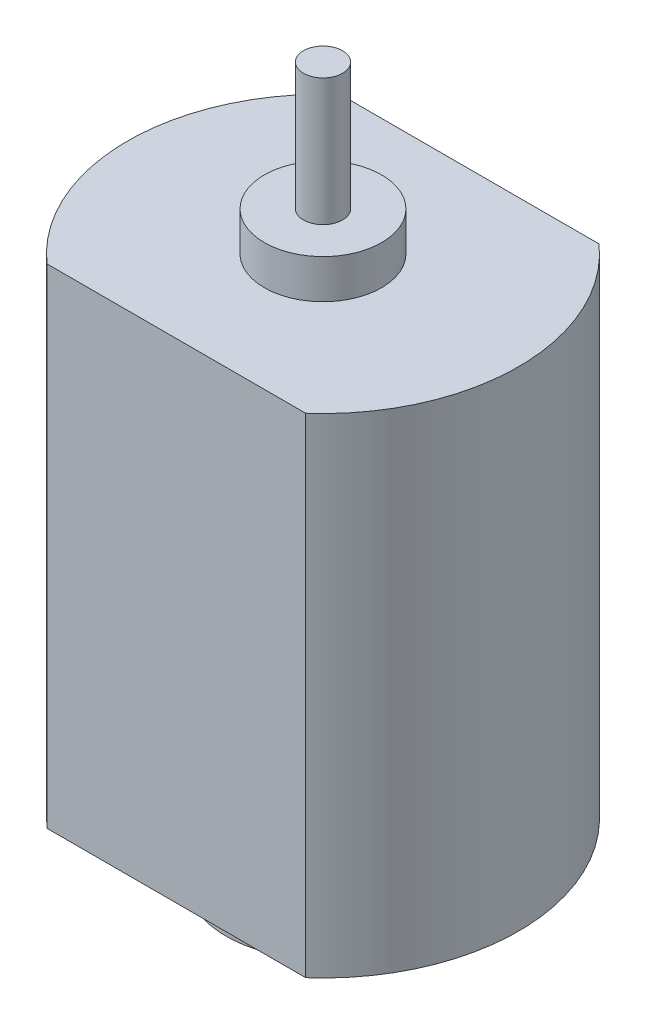
ISO-10303-21;
HEADER;
FILE_DESCRIPTION(('STEP AP214'),'2;1');
FILE_NAME('part.step','',(''),(''),'','','');
FILE_SCHEMA(('AUTOMOTIVE_DESIGN { 1 0 10303 214 1 1 1 1 }'));
ENDSEC;
DATA;
#1=APPLICATION_CONTEXT('core data for automotive mechanical design processes');
#2=APPLICATION_PROTOCOL_DEFINITION('international standard','automotive_design',2000,#1);
#3=PRODUCT_CONTEXT('',#1,'mechanical');
#4=PRODUCT('Part','Part','',(#3));
#5=PRODUCT_RELATED_PRODUCT_CATEGORY('part','',(#4));
#6=PRODUCT_DEFINITION_FORMATION('','',#4);
#7=PRODUCT_DEFINITION_CONTEXT('part definition',#1,'design');
#8=PRODUCT_DEFINITION('design','',#6,#7);
#9=PRODUCT_DEFINITION_SHAPE('','',#8);
#10=(LENGTH_UNIT() NAMED_UNIT(*) SI_UNIT(.MILLI.,.METRE.));
#11=(NAMED_UNIT(*) PLANE_ANGLE_UNIT() SI_UNIT($,.RADIAN.));
#12=(NAMED_UNIT(*) SI_UNIT($,.STERADIAN.) SOLID_ANGLE_UNIT());
#13=UNCERTAINTY_MEASURE_WITH_UNIT(LENGTH_MEASURE(1.E-05),#10,'distance_accuracy_value','');
#14=(GEOMETRIC_REPRESENTATION_CONTEXT(3) GLOBAL_UNCERTAINTY_ASSIGNED_CONTEXT((#13)) GLOBAL_UNIT_ASSIGNED_CONTEXT((#10,
#11,#12)) REPRESENTATION_CONTEXT('',''));
#15=CARTESIAN_POINT('',(0.,0.,0.));
#16=DIRECTION('',(0.,0.,1.));
#17=DIRECTION('',(1.,0.,0.));
#18=AXIS2_PLACEMENT_3D('',#15,#16,#17);
#19=CARTESIAN_POINT('',(0.,-25.,7.5));
#20=DIRECTION('',(0.,0.,1.));
#21=DIRECTION('',(1.,0.,0.));
#22=AXIS2_PLACEMENT_3D('',#19,#20,#21);
#23=PLANE('',#22);
#24=DIRECTION('',(1.,0.,0.));
#25=VECTOR('',#24,1.);
#26=CARTESIAN_POINT('',(0.,0.,7.5));
#27=LINE('',#26,#25);
#28=CARTESIAN_POINT('',(-6.61437827766148,0.,7.5));
#29=VERTEX_POINT('',#28);
#30=CARTESIAN_POINT('',(6.61437827766148,0.,7.5));
#31=VERTEX_POINT('',#30);
#32=EDGE_CURVE('E146',#29,#31,#27,.T.);
#33=ORIENTED_EDGE('',*,*,#32,.F.);
#34=DIRECTION('',(0.,1.,0.));
#35=VECTOR('',#34,1.);
#36=CARTESIAN_POINT('',(-6.61437827766148,-25.,7.5));
#37=LINE('',#36,#35);
#38=CARTESIAN_POINT('',(-6.61437827766148,-25.,7.5));
#39=VERTEX_POINT('',#38);
#40=EDGE_CURVE('E61',#39,#29,#37,.T.);
#41=ORIENTED_EDGE('',*,*,#40,.F.);
#42=DIRECTION('',(1.,0.,0.));
#43=VECTOR('',#42,1.);
#44=CARTESIAN_POINT('',(0.,-25.,7.5));
#45=LINE('',#44,#43);
#46=CARTESIAN_POINT('',(6.61437827766148,-25.,7.5));
#47=VERTEX_POINT('',#46);
#48=EDGE_CURVE('E148',#39,#47,#45,.T.);
#49=ORIENTED_EDGE('',*,*,#48,.T.);
#50=DIRECTION('',(0.,1.,0.));
#51=VECTOR('',#50,1.);
#52=CARTESIAN_POINT('',(6.61437827766148,-25.,7.5));
#53=LINE('',#52,#51);
#54=EDGE_CURVE('E102',#47,#31,#53,.T.);
#55=ORIENTED_EDGE('',*,*,#54,.T.);
#56=EDGE_LOOP('',(#33,#41,#49,#55));
#57=FACE_BOUND('',#56,.T.);
#58=ADVANCED_FACE('F52',(#57),#23,.T.);
#59=CARTESIAN_POINT('',(0.,-25.,0.));
#60=DIRECTION('',(0.,1.,0.));
#61=DIRECTION('',(0.,0.,1.));
#62=AXIS2_PLACEMENT_3D('',#59,#60,#61);
#63=CYLINDRICAL_SURFACE('',#62,10.);
#64=CARTESIAN_POINT('',(0.,0.,0.));
#65=DIRECTION('',(0.,1.,0.));
#66=DIRECTION('',(0.,0.,1.));
#67=AXIS2_PLACEMENT_3D('',#64,#65,#66);
#68=CIRCLE('',#67,10.);
#69=CARTESIAN_POINT('',(-6.61437827766148,0.,-7.5));
#70=VERTEX_POINT('',#69);
#71=EDGE_CURVE('E152',#70,#29,#68,.T.);
#72=ORIENTED_EDGE('',*,*,#71,.F.);
#73=DIRECTION('',(0.,1.,0.));
#74=VECTOR('',#73,1.);
#75=CARTESIAN_POINT('',(-6.61437827766148,-25.,-7.5));
#76=LINE('',#75,#74);
#77=CARTESIAN_POINT('',(-6.61437827766148,-25.,-7.5));
#78=VERTEX_POINT('',#77);
#79=EDGE_CURVE('E172',#78,#70,#76,.T.);
#80=ORIENTED_EDGE('',*,*,#79,.F.);
#81=CARTESIAN_POINT('',(0.,-25.,0.));
#82=DIRECTION('',(0.,1.,0.));
#83=DIRECTION('',(0.,0.,1.));
#84=AXIS2_PLACEMENT_3D('',#81,#82,#83);
#85=CIRCLE('',#84,10.);
#86=EDGE_CURVE('E156',#78,#39,#85,.T.);
#87=ORIENTED_EDGE('',*,*,#86,.T.);
#88=ORIENTED_EDGE('',*,*,#40,.T.);
#89=EDGE_LOOP('',(#72,#80,#87,#88));
#90=FACE_BOUND('',#89,.T.);
#91=ADVANCED_FACE('F180',(#90),#63,.T.);
#92=CARTESIAN_POINT('',(0.,-25.,-7.5));
#93=DIRECTION('',(0.,0.,1.));
#94=DIRECTION('',(1.,0.,0.));
#95=AXIS2_PLACEMENT_3D('',#92,#93,#94);
#96=PLANE('',#95);
#97=DIRECTION('',(1.,0.,0.));
#98=VECTOR('',#97,1.);
#99=CARTESIAN_POINT('',(0.,0.,-7.5));
#100=LINE('',#99,#98);
#101=CARTESIAN_POINT('',(6.61437827766148,0.,-7.5));
#102=VERTEX_POINT('',#101);
#103=EDGE_CURVE('E166',#70,#102,#100,.T.);
#104=ORIENTED_EDGE('',*,*,#103,.T.);
#105=DIRECTION('',(0.,1.,0.));
#106=VECTOR('',#105,1.);
#107=CARTESIAN_POINT('',(6.61437827766148,-25.,-7.5));
#108=LINE('',#107,#106);
#109=CARTESIAN_POINT('',(6.61437827766148,-25.,-7.5));
#110=VERTEX_POINT('',#109);
#111=EDGE_CURVE('E175',#110,#102,#108,.T.);
#112=ORIENTED_EDGE('',*,*,#111,.F.);
#113=DIRECTION('',(1.,0.,0.));
#114=VECTOR('',#113,1.);
#115=CARTESIAN_POINT('',(0.,-25.,-7.5));
#116=LINE('',#115,#114);
#117=EDGE_CURVE('E155',#78,#110,#116,.T.);
#118=ORIENTED_EDGE('',*,*,#117,.F.);
#119=ORIENTED_EDGE('',*,*,#79,.T.);
#120=EDGE_LOOP('',(#104,#112,#118,#119));
#121=FACE_BOUND('',#120,.T.);
#122=ADVANCED_FACE('F190',(#121),#96,.F.);
#123=EDGE_CURVE('E162',#31,#102,#68,.T.);
#124=ORIENTED_EDGE('',*,*,#123,.F.);
#125=ORIENTED_EDGE('',*,*,#54,.F.);
#126=EDGE_CURVE('E151',#47,#110,#85,.T.);
#127=ORIENTED_EDGE('',*,*,#126,.T.);
#128=ORIENTED_EDGE('',*,*,#111,.T.);
#129=EDGE_LOOP('',(#124,#125,#127,#128));
#130=FACE_BOUND('',#129,.T.);
#131=ADVANCED_FACE('F192',(#130),#63,.T.);
#132=CARTESIAN_POINT('',(0.,-25.,0.));
#133=DIRECTION('',(0.,1.,0.));
#134=DIRECTION('',(0.,0.,1.));
#135=AXIS2_PLACEMENT_3D('',#132,#133,#134);
#136=PLANE('',#135);
#137=DIRECTION('',(1.,0.,0.));
#138=VECTOR('',#137,1.);
#139=CARTESIAN_POINT('',(0.,-25.,-4.05));
#140=LINE('',#139,#138);
#141=CARTESIAN_POINT('',(-2.84604989415154,-25.,-4.05));
#142=VERTEX_POINT('',#141);
#143=CARTESIAN_POINT('',(2.84604989415154,-25.,-4.05));
#144=VERTEX_POINT('',#143);
#145=EDGE_CURVE('E132',#142,#144,#140,.T.);
#146=ORIENTED_EDGE('',*,*,#145,.F.);
#147=CARTESIAN_POINT('',(0.,-25.,0.));
#148=DIRECTION('',(0.,-1.,0.));
#149=DIRECTION('',(0.,0.,-1.));
#150=AXIS2_PLACEMENT_3D('',#147,#148,#149);
#151=CIRCLE('',#150,4.95);
#152=EDGE_CURVE('E68',#144,#142,#151,.T.);
#153=ORIENTED_EDGE('',*,*,#152,.F.);
#154=EDGE_LOOP('',(#146,#153));
#155=FACE_BOUND('',#154,.T.);
#156=ORIENTED_EDGE('',*,*,#48,.F.);
#157=ORIENTED_EDGE('',*,*,#86,.F.);
#158=ORIENTED_EDGE('',*,*,#117,.T.);
#159=ORIENTED_EDGE('',*,*,#126,.F.);
#160=EDGE_LOOP('',(#156,#157,#158,#159));
#161=FACE_BOUND('',#160,.T.);
#162=ADVANCED_FACE('F183',(#155,#161),#136,.F.);
#163=CARTESIAN_POINT('',(0.,0.,0.));
#164=DIRECTION('',(0.,1.,0.));
#165=DIRECTION('',(0.,0.,1.));
#166=AXIS2_PLACEMENT_3D('',#163,#164,#165);
#167=PLANE('',#166);
#168=CARTESIAN_POINT('',(0.,0.,0.));
#169=DIRECTION('',(0.,1.,0.));
#170=DIRECTION('',(0.,0.,1.));
#171=AXIS2_PLACEMENT_3D('',#168,#169,#170);
#172=CIRCLE('',#171,3.);
#173=CARTESIAN_POINT('',(0.,0.,3.));
#174=VERTEX_POINT('',#173);
#175=EDGE_CURVE('E12',#174,#174,#172,.T.);
#176=ORIENTED_EDGE('',*,*,#175,.F.);
#177=EDGE_LOOP('',(#176));
#178=FACE_BOUND('',#177,.T.);
#179=ORIENTED_EDGE('',*,*,#32,.T.);
#180=ORIENTED_EDGE('',*,*,#123,.T.);
#181=ORIENTED_EDGE('',*,*,#103,.F.);
#182=ORIENTED_EDGE('',*,*,#71,.T.);
#183=EDGE_LOOP('',(#179,#180,#181,#182));
#184=FACE_BOUND('',#183,.T.);
#185=ADVANCED_FACE('F203',(#178,#184),#167,.T.);
#186=CARTESIAN_POINT('',(0.,2.,0.));
#187=DIRECTION('',(0.,-1.,0.));
#188=DIRECTION('',(0.,0.,-1.));
#189=AXIS2_PLACEMENT_3D('',#186,#187,#188);
#190=CYLINDRICAL_SURFACE('',#189,3.);
#191=CARTESIAN_POINT('',(0.,2.,0.));
#192=DIRECTION('',(0.,1.,0.));
#193=DIRECTION('',(0.,0.,1.));
#194=AXIS2_PLACEMENT_3D('',#191,#192,#193);
#195=CIRCLE('',#194,3.);
#196=CARTESIAN_POINT('',(0.,2.,3.));
#197=VERTEX_POINT('',#196);
#198=EDGE_CURVE('E143',#197,#197,#195,.T.);
#199=ORIENTED_EDGE('',*,*,#198,.F.);
#200=EDGE_LOOP('',(#199));
#201=FACE_BOUND('',#200,.T.);
#202=ORIENTED_EDGE('',*,*,#175,.T.);
#203=EDGE_LOOP('',(#202));
#204=FACE_BOUND('',#203,.T.);
#205=ADVANCED_FACE('F232',(#201,#204),#190,.T.);
#206=CARTESIAN_POINT('',(0.,2.,0.));
#207=DIRECTION('',(0.,1.,0.));
#208=DIRECTION('',(0.,0.,1.));
#209=AXIS2_PLACEMENT_3D('',#206,#207,#208);
#210=PLANE('',#209);
#211=CARTESIAN_POINT('',(0.,2.,0.));
#212=DIRECTION('',(0.,1.,0.));
#213=DIRECTION('',(0.,0.,1.));
#214=AXIS2_PLACEMENT_3D('',#211,#212,#213);
#215=CIRCLE('',#214,1.);
#216=CARTESIAN_POINT('',(0.,2.,1.));
#217=VERTEX_POINT('',#216);
#218=EDGE_CURVE('E55',#217,#217,#215,.F.);
#219=ORIENTED_EDGE('',*,*,#218,.T.);
#220=EDGE_LOOP('',(#219));
#221=FACE_BOUND('',#220,.T.);
#222=ORIENTED_EDGE('',*,*,#198,.T.);
#223=EDGE_LOOP('',(#222));
#224=FACE_BOUND('',#223,.T.);
#225=ADVANCED_FACE('F212',(#221,#224),#210,.T.);
#226=CARTESIAN_POINT('',(0.,8.5,0.));
#227=DIRECTION('',(0.,-1.,0.));
#228=DIRECTION('',(0.,0.,-1.));
#229=AXIS2_PLACEMENT_3D('',#226,#227,#228);
#230=CYLINDRICAL_SURFACE('',#229,1.);
#231=ORIENTED_EDGE('',*,*,#218,.F.);
#232=EDGE_LOOP('',(#231));
#233=FACE_BOUND('',#232,.T.);
#234=CARTESIAN_POINT('',(0.,8.5,0.));
#235=DIRECTION('',(0.,1.,0.));
#236=DIRECTION('',(0.,0.,1.));
#237=AXIS2_PLACEMENT_3D('',#234,#235,#236);
#238=CIRCLE('',#237,1.);
#239=CARTESIAN_POINT('',(0.,8.5,1.));
#240=VERTEX_POINT('',#239);
#241=EDGE_CURVE('E134',#240,#240,#238,.T.);
#242=ORIENTED_EDGE('',*,*,#241,.F.);
#243=EDGE_LOOP('',(#242));
#244=FACE_BOUND('',#243,.T.);
#245=ADVANCED_FACE('F215',(#233,#244),#230,.T.);
#246=CARTESIAN_POINT('',(0.,8.5,0.));
#247=DIRECTION('',(0.,1.,0.));
#248=DIRECTION('',(0.,0.,1.));
#249=AXIS2_PLACEMENT_3D('',#246,#247,#248);
#250=PLANE('',#249);
#251=ORIENTED_EDGE('',*,*,#241,.T.);
#252=EDGE_LOOP('',(#251));
#253=FACE_BOUND('',#252,.T.);
#254=ADVANCED_FACE('F218',(#253),#250,.T.);
#255=CARTESIAN_POINT('',(0.,-27.75,-4.05));
#256=DIRECTION('',(0.,0.,1.));
#257=DIRECTION('',(1.,0.,0.));
#258=AXIS2_PLACEMENT_3D('',#255,#256,#257);
#259=PLANE('',#258);
#260=ORIENTED_EDGE('',*,*,#145,.T.);
#261=DIRECTION('',(0.,1.,0.));
#262=VECTOR('',#261,1.);
#263=CARTESIAN_POINT('',(2.84604989415154,-27.75,-4.05));
#264=LINE('',#263,#262);
#265=CARTESIAN_POINT('',(2.84604989415154,-27.75,-4.05));
#266=VERTEX_POINT('',#265);
#267=EDGE_CURVE('E118',#266,#144,#264,.T.);
#268=ORIENTED_EDGE('',*,*,#267,.F.);
#269=DIRECTION('',(1.,0.,0.));
#270=VECTOR('',#269,1.);
#271=CARTESIAN_POINT('',(0.,-27.75,-4.05));
#272=LINE('',#271,#270);
#273=CARTESIAN_POINT('',(-2.84604989415154,-27.75,-4.05));
#274=VERTEX_POINT('',#273);
#275=EDGE_CURVE('E125',#274,#266,#272,.T.);
#276=ORIENTED_EDGE('',*,*,#275,.F.);
#277=DIRECTION('',(0.,1.,0.));
#278=VECTOR('',#277,1.);
#279=CARTESIAN_POINT('',(-2.84604989415154,-27.75,-4.05));
#280=LINE('',#279,#278);
#281=EDGE_CURVE('E121',#274,#142,#280,.T.);
#282=ORIENTED_EDGE('',*,*,#281,.T.);
#283=EDGE_LOOP('',(#260,#268,#276,#282));
#284=FACE_BOUND('',#283,.T.);
#285=ADVANCED_FACE('F131',(#284),#259,.F.);
#286=CARTESIAN_POINT('',(0.,-27.75,0.));
#287=DIRECTION('',(0.,1.,0.));
#288=DIRECTION('',(0.,0.,1.));
#289=AXIS2_PLACEMENT_3D('',#286,#287,#288);
#290=CYLINDRICAL_SURFACE('',#289,4.95);
#291=ORIENTED_EDGE('',*,*,#152,.T.);
#292=ORIENTED_EDGE('',*,*,#281,.F.);
#293=CARTESIAN_POINT('',(0.,-27.75,0.));
#294=DIRECTION('',(0.,-1.,0.));
#295=DIRECTION('',(0.,0.,-1.));
#296=AXIS2_PLACEMENT_3D('',#293,#294,#295);
#297=CIRCLE('',#296,4.95);
#298=EDGE_CURVE('E114',#266,#274,#297,.T.);
#299=ORIENTED_EDGE('',*,*,#298,.F.);
#300=ORIENTED_EDGE('',*,*,#267,.T.);
#301=EDGE_LOOP('',(#291,#292,#299,#300));
#302=FACE_BOUND('',#301,.T.);
#303=ADVANCED_FACE('F116',(#302),#290,.T.);
#304=CARTESIAN_POINT('',(0.,-27.75,0.));
#305=DIRECTION('',(0.,-1.,0.));
#306=DIRECTION('',(0.,0.,-1.));
#307=AXIS2_PLACEMENT_3D('',#304,#305,#306);
#308=PLANE('',#307);
#309=ORIENTED_EDGE('',*,*,#275,.T.);
#310=ORIENTED_EDGE('',*,*,#298,.T.);
#311=EDGE_LOOP('',(#309,#310));
#312=FACE_BOUND('',#311,.T.);
#313=ADVANCED_FACE('F127',(#312),#308,.T.);
#314=CLOSED_SHELL('',(#58,#91,#122,#131,#162,#185,#205,#225,#245,#254,#285,#303,#313));
#315=MANIFOLD_SOLID_BREP('B2',#314);
#316=ADVANCED_BREP_SHAPE_REPRESENTATION('',(#18,#315),#14);
#317=SHAPE_DEFINITION_REPRESENTATION(#9,#316);
ENDSEC;
END-ISO-10303-21;
